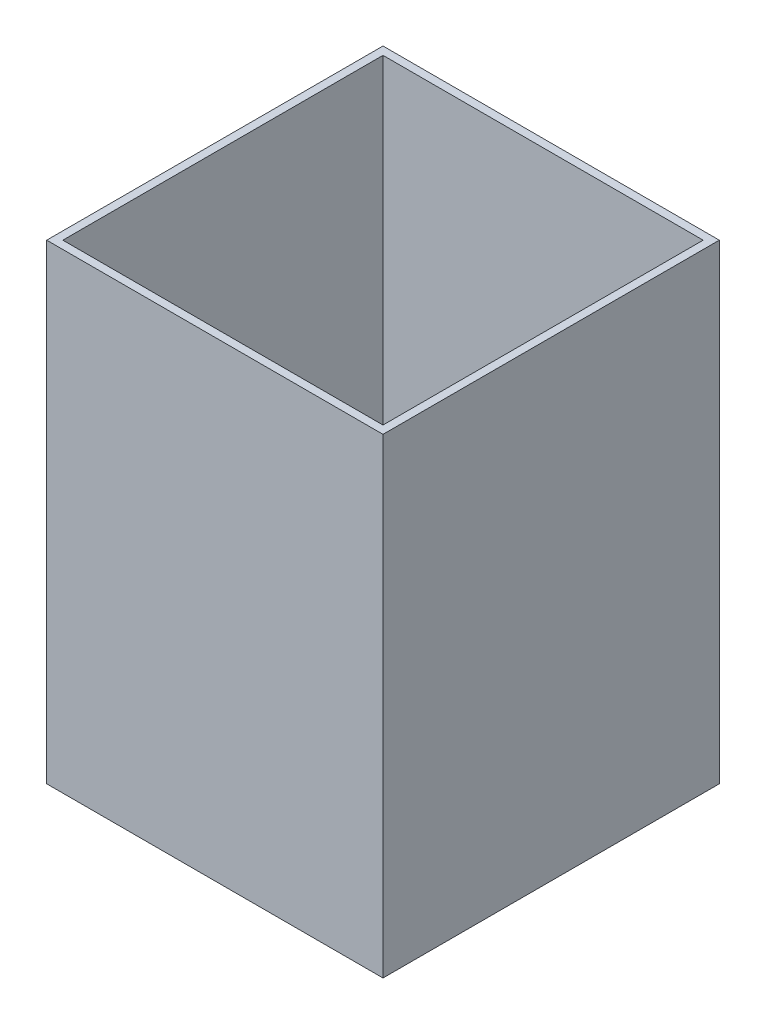
ISO-10303-21;
HEADER;
FILE_DESCRIPTION(('STEP AP214'),'2;1');
FILE_NAME('part.step','',(''),(''),'','','');
FILE_SCHEMA(('AUTOMOTIVE_DESIGN { 1 0 10303 214 1 1 1 1 }'));
ENDSEC;
DATA;
#1=APPLICATION_CONTEXT('core data for automotive mechanical design processes');
#2=APPLICATION_PROTOCOL_DEFINITION('international standard','automotive_design',2000,#1);
#3=PRODUCT_CONTEXT('',#1,'mechanical');
#4=PRODUCT('Part','Part','',(#3));
#5=PRODUCT_RELATED_PRODUCT_CATEGORY('part','',(#4));
#6=PRODUCT_DEFINITION_FORMATION('','',#4);
#7=PRODUCT_DEFINITION_CONTEXT('part definition',#1,'design');
#8=PRODUCT_DEFINITION('design','',#6,#7);
#9=PRODUCT_DEFINITION_SHAPE('','',#8);
#10=(LENGTH_UNIT() NAMED_UNIT(*) SI_UNIT(.MILLI.,.METRE.));
#11=(NAMED_UNIT(*) PLANE_ANGLE_UNIT() SI_UNIT($,.RADIAN.));
#12=(NAMED_UNIT(*) SI_UNIT($,.STERADIAN.) SOLID_ANGLE_UNIT());
#13=UNCERTAINTY_MEASURE_WITH_UNIT(LENGTH_MEASURE(1.E-05),#10,'distance_accuracy_value','');
#14=(GEOMETRIC_REPRESENTATION_CONTEXT(3) GLOBAL_UNCERTAINTY_ASSIGNED_CONTEXT((#13)) GLOBAL_UNIT_ASSIGNED_CONTEXT((#10,
#11,#12)) REPRESENTATION_CONTEXT('',''));
#15=CARTESIAN_POINT('',(0.,0.,0.));
#16=DIRECTION('',(0.,0.,1.));
#17=DIRECTION('',(1.,0.,0.));
#18=AXIS2_PLACEMENT_3D('',#15,#16,#17);
#19=CARTESIAN_POINT('',(125.,350.,125.));
#20=DIRECTION('',(-1.,0.,0.));
#21=DIRECTION('',(0.,0.,1.));
#22=AXIS2_PLACEMENT_3D('',#19,#20,#21);
#23=PLANE('',#22);
#24=DIRECTION('',(0.,0.,-1.));
#25=VECTOR('',#24,1.);
#26=CARTESIAN_POINT('',(125.,0.,125.));
#27=LINE('',#26,#25);
#28=CARTESIAN_POINT('',(125.,0.,125.));
#29=VERTEX_POINT('',#28);
#30=CARTESIAN_POINT('',(125.,0.,-125.));
#31=VERTEX_POINT('',#30);
#32=EDGE_CURVE('E130',#29,#31,#27,.T.);
#33=ORIENTED_EDGE('',*,*,#32,.T.);
#34=DIRECTION('',(0.,-1.,0.));
#35=VECTOR('',#34,1.);
#36=CARTESIAN_POINT('',(125.,350.,-125.));
#37=LINE('',#36,#35);
#38=CARTESIAN_POINT('',(125.,350.,-125.));
#39=VERTEX_POINT('',#38);
#40=EDGE_CURVE('E11',#39,#31,#37,.T.);
#41=ORIENTED_EDGE('',*,*,#40,.F.);
#42=DIRECTION('',(0.,0.,-1.));
#43=VECTOR('',#42,1.);
#44=CARTESIAN_POINT('',(125.,350.,125.));
#45=LINE('',#44,#43);
#46=CARTESIAN_POINT('',(125.,350.,125.));
#47=VERTEX_POINT('',#46);
#48=EDGE_CURVE('E134',#47,#39,#45,.T.);
#49=ORIENTED_EDGE('',*,*,#48,.F.);
#50=DIRECTION('',(0.,-1.,0.));
#51=VECTOR('',#50,1.);
#52=CARTESIAN_POINT('',(125.,350.,125.));
#53=LINE('',#52,#51);
#54=EDGE_CURVE('E144',#47,#29,#53,.T.);
#55=ORIENTED_EDGE('',*,*,#54,.T.);
#56=EDGE_LOOP('',(#33,#41,#49,#55));
#57=FACE_BOUND('',#56,.T.);
#58=ADVANCED_FACE('F33',(#57),#23,.F.);
#59=CARTESIAN_POINT('',(-125.,350.,-125.));
#60=DIRECTION('',(0.,0.,1.));
#61=DIRECTION('',(1.,0.,0.));
#62=AXIS2_PLACEMENT_3D('',#59,#60,#61);
#63=PLANE('',#62);
#64=DIRECTION('',(-1.,0.,0.));
#65=VECTOR('',#64,1.);
#66=CARTESIAN_POINT('',(-125.,0.,-125.));
#67=LINE('',#66,#65);
#68=CARTESIAN_POINT('',(-125.,0.,-125.));
#69=VERTEX_POINT('',#68);
#70=EDGE_CURVE('E147',#31,#69,#67,.T.);
#71=ORIENTED_EDGE('',*,*,#70,.T.);
#72=DIRECTION('',(0.,-1.,0.));
#73=VECTOR('',#72,1.);
#74=CARTESIAN_POINT('',(-125.,350.,-125.));
#75=LINE('',#74,#73);
#76=CARTESIAN_POINT('',(-125.,350.,-125.));
#77=VERTEX_POINT('',#76);
#78=EDGE_CURVE('E40',#77,#69,#75,.T.);
#79=ORIENTED_EDGE('',*,*,#78,.F.);
#80=DIRECTION('',(-1.,0.,0.));
#81=VECTOR('',#80,1.);
#82=CARTESIAN_POINT('',(-125.,350.,-125.));
#83=LINE('',#82,#81);
#84=EDGE_CURVE('E137',#39,#77,#83,.T.);
#85=ORIENTED_EDGE('',*,*,#84,.F.);
#86=ORIENTED_EDGE('',*,*,#40,.T.);
#87=EDGE_LOOP('',(#71,#79,#85,#86));
#88=FACE_BOUND('',#87,.T.);
#89=ADVANCED_FACE('F175',(#88),#63,.F.);
#90=CARTESIAN_POINT('',(-125.,350.,125.));
#91=DIRECTION('',(1.,0.,0.));
#92=DIRECTION('',(0.,0.,-1.));
#93=AXIS2_PLACEMENT_3D('',#90,#91,#92);
#94=PLANE('',#93);
#95=DIRECTION('',(0.,0.,1.));
#96=VECTOR('',#95,1.);
#97=CARTESIAN_POINT('',(-125.,0.,125.));
#98=LINE('',#97,#96);
#99=CARTESIAN_POINT('',(-125.,0.,125.));
#100=VERTEX_POINT('',#99);
#101=EDGE_CURVE('E149',#69,#100,#98,.T.);
#102=ORIENTED_EDGE('',*,*,#101,.T.);
#103=DIRECTION('',(0.,-1.,0.));
#104=VECTOR('',#103,1.);
#105=CARTESIAN_POINT('',(-125.,350.,125.));
#106=LINE('',#105,#104);
#107=CARTESIAN_POINT('',(-125.,350.,125.));
#108=VERTEX_POINT('',#107);
#109=EDGE_CURVE('E154',#108,#100,#106,.T.);
#110=ORIENTED_EDGE('',*,*,#109,.F.);
#111=DIRECTION('',(0.,0.,1.));
#112=VECTOR('',#111,1.);
#113=CARTESIAN_POINT('',(-125.,350.,125.));
#114=LINE('',#113,#112);
#115=EDGE_CURVE('E140',#77,#108,#114,.T.);
#116=ORIENTED_EDGE('',*,*,#115,.F.);
#117=ORIENTED_EDGE('',*,*,#78,.T.);
#118=EDGE_LOOP('',(#102,#110,#116,#117));
#119=FACE_BOUND('',#118,.T.);
#120=ADVANCED_FACE('F161',(#119),#94,.F.);
#121=CARTESIAN_POINT('',(-125.,350.,125.));
#122=DIRECTION('',(0.,0.,-1.));
#123=DIRECTION('',(-1.,0.,0.));
#124=AXIS2_PLACEMENT_3D('',#121,#122,#123);
#125=PLANE('',#124);
#126=DIRECTION('',(1.,0.,0.));
#127=VECTOR('',#126,1.);
#128=CARTESIAN_POINT('',(-125.,0.,125.));
#129=LINE('',#128,#127);
#130=EDGE_CURVE('E138',#100,#29,#129,.T.);
#131=ORIENTED_EDGE('',*,*,#130,.T.);
#132=ORIENTED_EDGE('',*,*,#54,.F.);
#133=DIRECTION('',(1.,0.,0.));
#134=VECTOR('',#133,1.);
#135=CARTESIAN_POINT('',(-125.,350.,125.));
#136=LINE('',#135,#134);
#137=EDGE_CURVE('E142',#108,#47,#136,.T.);
#138=ORIENTED_EDGE('',*,*,#137,.F.);
#139=ORIENTED_EDGE('',*,*,#109,.T.);
#140=EDGE_LOOP('',(#131,#132,#138,#139));
#141=FACE_BOUND('',#140,.T.);
#142=ADVANCED_FACE('F168',(#141),#125,.F.);
#143=CARTESIAN_POINT('',(0.,350.,0.));
#144=DIRECTION('',(0.,-1.,0.));
#145=DIRECTION('',(0.,0.,-1.));
#146=AXIS2_PLACEMENT_3D('',#143,#144,#145);
#147=PLANE('',#146);
#148=DIRECTION('',(-1.,0.,0.));
#149=VECTOR('',#148,1.);
#150=CARTESIAN_POINT('',(-119.,350.,-119.));
#151=LINE('',#150,#149);
#152=CARTESIAN_POINT('',(119.,350.,-119.));
#153=VERTEX_POINT('',#152);
#154=CARTESIAN_POINT('',(-119.,350.,-119.));
#155=VERTEX_POINT('',#154);
#156=EDGE_CURVE('E124',#153,#155,#151,.T.);
#157=ORIENTED_EDGE('',*,*,#156,.F.);
#158=DIRECTION('',(0.,0.,-1.));
#159=VECTOR('',#158,1.);
#160=CARTESIAN_POINT('',(119.,350.,-119.));
#161=LINE('',#160,#159);
#162=CARTESIAN_POINT('',(119.,350.,119.));
#163=VERTEX_POINT('',#162);
#164=EDGE_CURVE('E47',#163,#153,#161,.T.);
#165=ORIENTED_EDGE('',*,*,#164,.F.);
#166=DIRECTION('',(1.,0.,0.));
#167=VECTOR('',#166,1.);
#168=CARTESIAN_POINT('',(-119.,350.,119.));
#169=LINE('',#168,#167);
#170=CARTESIAN_POINT('',(-119.,350.,119.));
#171=VERTEX_POINT('',#170);
#172=EDGE_CURVE('E115',#171,#163,#169,.T.);
#173=ORIENTED_EDGE('',*,*,#172,.F.);
#174=DIRECTION('',(0.,0.,1.));
#175=VECTOR('',#174,1.);
#176=CARTESIAN_POINT('',(-119.,350.,-119.));
#177=LINE('',#176,#175);
#178=EDGE_CURVE('E118',#155,#171,#177,.T.);
#179=ORIENTED_EDGE('',*,*,#178,.F.);
#180=EDGE_LOOP('',(#157,#165,#173,#179));
#181=FACE_BOUND('',#180,.T.);
#182=ORIENTED_EDGE('',*,*,#48,.T.);
#183=ORIENTED_EDGE('',*,*,#84,.T.);
#184=ORIENTED_EDGE('',*,*,#115,.T.);
#185=ORIENTED_EDGE('',*,*,#137,.T.);
#186=EDGE_LOOP('',(#182,#183,#184,#185));
#187=FACE_BOUND('',#186,.T.);
#188=ADVANCED_FACE('F174',(#181,#187),#147,.F.);
#189=CARTESIAN_POINT('',(0.,0.,0.));
#190=DIRECTION('',(0.,-1.,0.));
#191=DIRECTION('',(0.,0.,-1.));
#192=AXIS2_PLACEMENT_3D('',#189,#190,#191);
#193=PLANE('',#192);
#194=DIRECTION('',(0.,0.,-1.));
#195=VECTOR('',#194,1.);
#196=CARTESIAN_POINT('',(119.,0.,-119.));
#197=LINE('',#196,#195);
#198=CARTESIAN_POINT('',(119.,0.,119.));
#199=VERTEX_POINT('',#198);
#200=CARTESIAN_POINT('',(119.,0.,-119.));
#201=VERTEX_POINT('',#200);
#202=EDGE_CURVE('E99',#199,#201,#197,.T.);
#203=ORIENTED_EDGE('',*,*,#202,.T.);
#204=DIRECTION('',(-1.,0.,0.));
#205=VECTOR('',#204,1.);
#206=CARTESIAN_POINT('',(-119.,0.,-119.));
#207=LINE('',#206,#205);
#208=CARTESIAN_POINT('',(-119.,0.,-119.));
#209=VERTEX_POINT('',#208);
#210=EDGE_CURVE('E108',#201,#209,#207,.T.);
#211=ORIENTED_EDGE('',*,*,#210,.T.);
#212=DIRECTION('',(0.,0.,1.));
#213=VECTOR('',#212,1.);
#214=CARTESIAN_POINT('',(-119.,0.,-119.));
#215=LINE('',#214,#213);
#216=CARTESIAN_POINT('',(-119.,0.,119.));
#217=VERTEX_POINT('',#216);
#218=EDGE_CURVE('E55',#209,#217,#215,.T.);
#219=ORIENTED_EDGE('',*,*,#218,.T.);
#220=DIRECTION('',(1.,0.,0.));
#221=VECTOR('',#220,1.);
#222=CARTESIAN_POINT('',(-119.,0.,119.));
#223=LINE('',#222,#221);
#224=EDGE_CURVE('E105',#217,#199,#223,.T.);
#225=ORIENTED_EDGE('',*,*,#224,.T.);
#226=EDGE_LOOP('',(#203,#211,#219,#225));
#227=FACE_BOUND('',#226,.T.);
#228=ORIENTED_EDGE('',*,*,#32,.F.);
#229=ORIENTED_EDGE('',*,*,#130,.F.);
#230=ORIENTED_EDGE('',*,*,#101,.F.);
#231=ORIENTED_EDGE('',*,*,#70,.F.);
#232=EDGE_LOOP('',(#228,#229,#230,#231));
#233=FACE_BOUND('',#232,.T.);
#234=ADVANCED_FACE('F112',(#227,#233),#193,.T.);
#235=CARTESIAN_POINT('',(119.,0.,-119.));
#236=DIRECTION('',(1.,0.,0.));
#237=DIRECTION('',(0.,0.,-1.));
#238=AXIS2_PLACEMENT_3D('',#235,#236,#237);
#239=PLANE('',#238);
#240=ORIENTED_EDGE('',*,*,#164,.T.);
#241=DIRECTION('',(0.,1.,0.));
#242=VECTOR('',#241,1.);
#243=CARTESIAN_POINT('',(119.,0.,-119.));
#244=LINE('',#243,#242);
#245=EDGE_CURVE('E95',#201,#153,#244,.T.);
#246=ORIENTED_EDGE('',*,*,#245,.F.);
#247=ORIENTED_EDGE('',*,*,#202,.F.);
#248=DIRECTION('',(0.,1.,0.));
#249=VECTOR('',#248,1.);
#250=CARTESIAN_POINT('',(119.,0.,119.));
#251=LINE('',#250,#249);
#252=EDGE_CURVE('E128',#199,#163,#251,.T.);
#253=ORIENTED_EDGE('',*,*,#252,.T.);
#254=EDGE_LOOP('',(#240,#246,#247,#253));
#255=FACE_BOUND('',#254,.T.);
#256=ADVANCED_FACE('F97',(#255),#239,.F.);
#257=CARTESIAN_POINT('',(-119.,0.,119.));
#258=DIRECTION('',(0.,0.,1.));
#259=DIRECTION('',(1.,0.,0.));
#260=AXIS2_PLACEMENT_3D('',#257,#258,#259);
#261=PLANE('',#260);
#262=ORIENTED_EDGE('',*,*,#172,.T.);
#263=ORIENTED_EDGE('',*,*,#252,.F.);
#264=ORIENTED_EDGE('',*,*,#224,.F.);
#265=DIRECTION('',(0.,1.,0.));
#266=VECTOR('',#265,1.);
#267=CARTESIAN_POINT('',(-119.,0.,119.));
#268=LINE('',#267,#266);
#269=EDGE_CURVE('E131',#217,#171,#268,.T.);
#270=ORIENTED_EDGE('',*,*,#269,.T.);
#271=EDGE_LOOP('',(#262,#263,#264,#270));
#272=FACE_BOUND('',#271,.T.);
#273=ADVANCED_FACE('F192',(#272),#261,.F.);
#274=CARTESIAN_POINT('',(-119.,0.,-119.));
#275=DIRECTION('',(-1.,0.,0.));
#276=DIRECTION('',(0.,0.,1.));
#277=AXIS2_PLACEMENT_3D('',#274,#275,#276);
#278=PLANE('',#277);
#279=ORIENTED_EDGE('',*,*,#178,.T.);
#280=ORIENTED_EDGE('',*,*,#269,.F.);
#281=ORIENTED_EDGE('',*,*,#218,.F.);
#282=DIRECTION('',(0.,1.,0.));
#283=VECTOR('',#282,1.);
#284=CARTESIAN_POINT('',(-119.,0.,-119.));
#285=LINE('',#284,#283);
#286=EDGE_CURVE('E104',#209,#155,#285,.T.);
#287=ORIENTED_EDGE('',*,*,#286,.T.);
#288=EDGE_LOOP('',(#279,#280,#281,#287));
#289=FACE_BOUND('',#288,.T.);
#290=ADVANCED_FACE('F195',(#289),#278,.F.);
#291=CARTESIAN_POINT('',(-119.,0.,-119.));
#292=DIRECTION('',(0.,0.,-1.));
#293=DIRECTION('',(-1.,0.,0.));
#294=AXIS2_PLACEMENT_3D('',#291,#292,#293);
#295=PLANE('',#294);
#296=ORIENTED_EDGE('',*,*,#156,.T.);
#297=ORIENTED_EDGE('',*,*,#286,.F.);
#298=ORIENTED_EDGE('',*,*,#210,.F.);
#299=ORIENTED_EDGE('',*,*,#245,.T.);
#300=EDGE_LOOP('',(#296,#297,#298,#299));
#301=FACE_BOUND('',#300,.T.);
#302=ADVANCED_FACE('F109',(#301),#295,.F.);
#303=CLOSED_SHELL('',(#58,#89,#120,#142,#188,#234,#256,#273,#290,#302));
#304=MANIFOLD_SOLID_BREP('B2',#303);
#305=ADVANCED_BREP_SHAPE_REPRESENTATION('',(#18,#304),#14);
#306=SHAPE_DEFINITION_REPRESENTATION(#9,#305);
ENDSEC;
END-ISO-10303-21;
